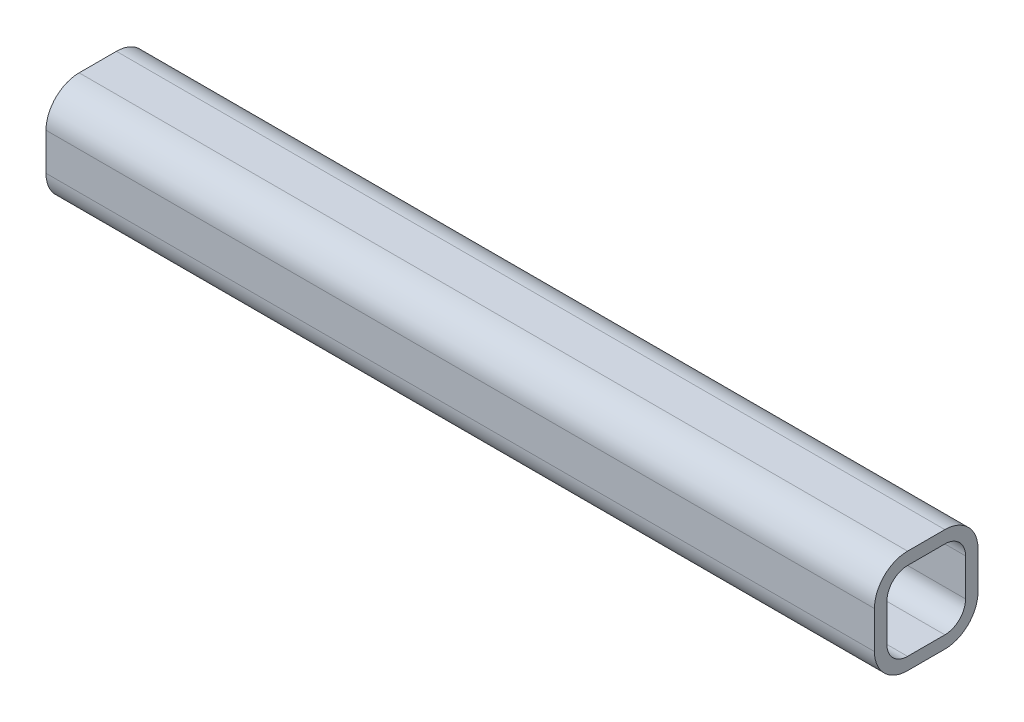
ISO-10303-21;
HEADER;
FILE_DESCRIPTION(('STEP AP214'),'2;1');
FILE_NAME('part.step','',(''),(''),'','','');
FILE_SCHEMA(('AUTOMOTIVE_DESIGN { 1 0 10303 214 1 1 1 1 }'));
ENDSEC;
DATA;
#1=APPLICATION_CONTEXT('core data for automotive mechanical design processes');
#2=APPLICATION_PROTOCOL_DEFINITION('international standard','automotive_design',2000,#1);
#3=PRODUCT_CONTEXT('',#1,'mechanical');
#4=PRODUCT('Part','Part','',(#3));
#5=PRODUCT_RELATED_PRODUCT_CATEGORY('part','',(#4));
#6=PRODUCT_DEFINITION_FORMATION('','',#4);
#7=PRODUCT_DEFINITION_CONTEXT('part definition',#1,'design');
#8=PRODUCT_DEFINITION('design','',#6,#7);
#9=PRODUCT_DEFINITION_SHAPE('','',#8);
#10=(LENGTH_UNIT() NAMED_UNIT(*) SI_UNIT(.MILLI.,.METRE.));
#11=(NAMED_UNIT(*) PLANE_ANGLE_UNIT() SI_UNIT($,.RADIAN.));
#12=(NAMED_UNIT(*) SI_UNIT($,.STERADIAN.) SOLID_ANGLE_UNIT());
#13=UNCERTAINTY_MEASURE_WITH_UNIT(LENGTH_MEASURE(1.E-05),#10,'distance_accuracy_value','');
#14=(GEOMETRIC_REPRESENTATION_CONTEXT(3) GLOBAL_UNCERTAINTY_ASSIGNED_CONTEXT((#13)) GLOBAL_UNIT_ASSIGNED_CONTEXT((#10,
#11,#12)) REPRESENTATION_CONTEXT('',''));
#15=CARTESIAN_POINT('',(0.,0.,0.));
#16=DIRECTION('',(0.,0.,1.));
#17=DIRECTION('',(1.,0.,0.));
#18=AXIS2_PLACEMENT_3D('',#15,#16,#17);
#19=CARTESIAN_POINT('',(0.,4.5,4.5));
#20=DIRECTION('',(1.,0.,0.));
#21=DIRECTION('',(0.,0.,-1.));
#22=AXIS2_PLACEMENT_3D('',#19,#20,#21);
#23=PLANE('',#22);
#24=DIRECTION('',(0.,0.,1.));
#25=VECTOR('',#24,1.);
#26=CARTESIAN_POINT('',(0.,9.5,4.5));
#27=LINE('',#26,#25);
#28=CARTESIAN_POINT('',(0.,9.5,-4.5));
#29=VERTEX_POINT('',#28);
#30=CARTESIAN_POINT('',(0.,9.5,4.5));
#31=VERTEX_POINT('',#30);
#32=EDGE_CURVE('E145',#29,#31,#27,.T.);
#33=ORIENTED_EDGE('',*,*,#32,.T.);
#34=CARTESIAN_POINT('',(0.,4.5,4.5));
#35=DIRECTION('',(1.,0.,0.));
#36=DIRECTION('',(0.,0.,-1.));
#37=AXIS2_PLACEMENT_3D('',#34,#35,#36);
#38=CIRCLE('',#37,5.);
#39=CARTESIAN_POINT('',(0.,4.5,9.5));
#40=VERTEX_POINT('',#39);
#41=EDGE_CURVE('E152',#31,#40,#38,.T.);
#42=ORIENTED_EDGE('',*,*,#41,.T.);
#43=DIRECTION('',(0.,-1.,0.));
#44=VECTOR('',#43,1.);
#45=CARTESIAN_POINT('',(0.,-4.5,9.5));
#46=LINE('',#45,#44);
#47=CARTESIAN_POINT('',(0.,-4.5,9.5));
#48=VERTEX_POINT('',#47);
#49=EDGE_CURVE('E428',#40,#48,#46,.T.);
#50=ORIENTED_EDGE('',*,*,#49,.T.);
#51=CARTESIAN_POINT('',(0.,-4.5,4.5));
#52=DIRECTION('',(1.,0.,0.));
#53=DIRECTION('',(0.,0.,-1.));
#54=AXIS2_PLACEMENT_3D('',#51,#52,#53);
#55=CIRCLE('',#54,5.);
#56=CARTESIAN_POINT('',(0.,-9.5,4.5));
#57=VERTEX_POINT('',#56);
#58=EDGE_CURVE('E421',#48,#57,#55,.T.);
#59=ORIENTED_EDGE('',*,*,#58,.T.);
#60=DIRECTION('',(0.,0.,-1.));
#61=VECTOR('',#60,1.);
#62=CARTESIAN_POINT('',(0.,-9.5,4.5));
#63=LINE('',#62,#61);
#64=CARTESIAN_POINT('',(0.,-9.5,-4.5));
#65=VERTEX_POINT('',#64);
#66=EDGE_CURVE('E413',#57,#65,#63,.T.);
#67=ORIENTED_EDGE('',*,*,#66,.T.);
#68=CARTESIAN_POINT('',(0.,-4.5,-4.5));
#69=DIRECTION('',(1.,0.,0.));
#70=DIRECTION('',(0.,0.,-1.));
#71=AXIS2_PLACEMENT_3D('',#68,#69,#70);
#72=CIRCLE('',#71,5.);
#73=CARTESIAN_POINT('',(0.,-4.5,-9.5));
#74=VERTEX_POINT('',#73);
#75=EDGE_CURVE('E169',#65,#74,#72,.T.);
#76=ORIENTED_EDGE('',*,*,#75,.T.);
#77=DIRECTION('',(0.,1.,0.));
#78=VECTOR('',#77,1.);
#79=CARTESIAN_POINT('',(0.,-4.5,-9.5));
#80=LINE('',#79,#78);
#81=CARTESIAN_POINT('',(0.,4.5,-9.5));
#82=VERTEX_POINT('',#81);
#83=EDGE_CURVE('E167',#74,#82,#80,.T.);
#84=ORIENTED_EDGE('',*,*,#83,.T.);
#85=CARTESIAN_POINT('',(0.,4.5,-4.5));
#86=DIRECTION('',(1.,0.,0.));
#87=DIRECTION('',(0.,0.,-1.));
#88=AXIS2_PLACEMENT_3D('',#85,#86,#87);
#89=CIRCLE('',#88,5.);
#90=EDGE_CURVE('E157',#82,#29,#89,.T.);
#91=ORIENTED_EDGE('',*,*,#90,.T.);
#92=EDGE_LOOP('',(#33,#42,#50,#59,#67,#76,#84,#91));
#93=FACE_BOUND('',#92,.T.);
#94=CARTESIAN_POINT('',(0.,4.5,4.5));
#95=DIRECTION('',(1.,0.,0.));
#96=DIRECTION('',(0.,0.,-1.));
#97=AXIS2_PLACEMENT_3D('',#94,#95,#96);
#98=CIRCLE('',#97,8.);
#99=CARTESIAN_POINT('',(0.,12.5,4.5));
#100=VERTEX_POINT('',#99);
#101=CARTESIAN_POINT('',(0.,4.5,12.5));
#102=VERTEX_POINT('',#101);
#103=EDGE_CURVE('E36',#100,#102,#98,.T.);
#104=ORIENTED_EDGE('',*,*,#103,.F.);
#105=DIRECTION('',(0.,0.,1.));
#106=VECTOR('',#105,1.);
#107=CARTESIAN_POINT('',(0.,12.5,4.5));
#108=LINE('',#107,#106);
#109=CARTESIAN_POINT('',(0.,12.5,-4.5));
#110=VERTEX_POINT('',#109);
#111=EDGE_CURVE('E176',#110,#100,#108,.T.);
#112=ORIENTED_EDGE('',*,*,#111,.F.);
#113=CARTESIAN_POINT('',(0.,4.5,-4.5));
#114=DIRECTION('',(1.,0.,0.));
#115=DIRECTION('',(0.,0.,-1.));
#116=AXIS2_PLACEMENT_3D('',#113,#114,#115);
#117=CIRCLE('',#116,8.);
#118=CARTESIAN_POINT('',(0.,4.5,-12.5));
#119=VERTEX_POINT('',#118);
#120=EDGE_CURVE('E185',#119,#110,#117,.T.);
#121=ORIENTED_EDGE('',*,*,#120,.F.);
#122=DIRECTION('',(0.,1.,0.));
#123=VECTOR('',#122,1.);
#124=CARTESIAN_POINT('',(0.,4.5,-12.5));
#125=LINE('',#124,#123);
#126=CARTESIAN_POINT('',(0.,-4.5,-12.5));
#127=VERTEX_POINT('',#126);
#128=EDGE_CURVE('E219',#127,#119,#125,.T.);
#129=ORIENTED_EDGE('',*,*,#128,.F.);
#130=CARTESIAN_POINT('',(0.,-4.5,-4.5));
#131=DIRECTION('',(1.,0.,0.));
#132=DIRECTION('',(0.,0.,-1.));
#133=AXIS2_PLACEMENT_3D('',#130,#131,#132);
#134=CIRCLE('',#133,8.);
#135=CARTESIAN_POINT('',(0.,-12.5,-4.5));
#136=VERTEX_POINT('',#135);
#137=EDGE_CURVE('E222',#136,#127,#134,.T.);
#138=ORIENTED_EDGE('',*,*,#137,.F.);
#139=DIRECTION('',(0.,0.,-1.));
#140=VECTOR('',#139,1.);
#141=CARTESIAN_POINT('',(0.,-12.5,4.5));
#142=LINE('',#141,#140);
#143=CARTESIAN_POINT('',(0.,-12.5,4.5));
#144=VERTEX_POINT('',#143);
#145=EDGE_CURVE('E225',#144,#136,#142,.T.);
#146=ORIENTED_EDGE('',*,*,#145,.F.);
#147=CARTESIAN_POINT('',(0.,-4.5,4.5));
#148=DIRECTION('',(1.,0.,0.));
#149=DIRECTION('',(0.,0.,-1.));
#150=AXIS2_PLACEMENT_3D('',#147,#148,#149);
#151=CIRCLE('',#150,8.);
#152=CARTESIAN_POINT('',(0.,-4.5,12.5));
#153=VERTEX_POINT('',#152);
#154=EDGE_CURVE('E228',#153,#144,#151,.T.);
#155=ORIENTED_EDGE('',*,*,#154,.F.);
#156=DIRECTION('',(0.,-1.,0.));
#157=VECTOR('',#156,1.);
#158=CARTESIAN_POINT('',(0.,4.5,12.5));
#159=LINE('',#158,#157);
#160=EDGE_CURVE('E230',#102,#153,#159,.T.);
#161=ORIENTED_EDGE('',*,*,#160,.F.);
#162=EDGE_LOOP('',(#104,#112,#121,#129,#138,#146,#155,#161));
#163=FACE_BOUND('',#162,.T.);
#164=ADVANCED_FACE('F32',(#93,#163),#23,.F.);
#165=CARTESIAN_POINT('',(200.,4.5,4.5));
#166=DIRECTION('',(1.,0.,0.));
#167=DIRECTION('',(0.,0.,-1.));
#168=AXIS2_PLACEMENT_3D('',#165,#166,#167);
#169=PLANE('',#168);
#170=CARTESIAN_POINT('',(200.,4.5,4.5));
#171=DIRECTION('',(1.,0.,0.));
#172=DIRECTION('',(0.,0.,-1.));
#173=AXIS2_PLACEMENT_3D('',#170,#171,#172);
#174=CIRCLE('',#173,5.);
#175=CARTESIAN_POINT('',(200.,9.5,4.5));
#176=VERTEX_POINT('',#175);
#177=CARTESIAN_POINT('',(200.,4.5,9.5));
#178=VERTEX_POINT('',#177);
#179=EDGE_CURVE('E437',#176,#178,#174,.T.);
#180=ORIENTED_EDGE('',*,*,#179,.F.);
#181=DIRECTION('',(0.,0.,1.));
#182=VECTOR('',#181,1.);
#183=CARTESIAN_POINT('',(200.,9.5,4.5));
#184=LINE('',#183,#182);
#185=CARTESIAN_POINT('',(200.,9.5,-4.5));
#186=VERTEX_POINT('',#185);
#187=EDGE_CURVE('E162',#186,#176,#184,.T.);
#188=ORIENTED_EDGE('',*,*,#187,.F.);
#189=CARTESIAN_POINT('',(200.,4.5,-4.5));
#190=DIRECTION('',(1.,0.,0.));
#191=DIRECTION('',(0.,0.,-1.));
#192=AXIS2_PLACEMENT_3D('',#189,#190,#191);
#193=CIRCLE('',#192,5.);
#194=CARTESIAN_POINT('',(200.,4.5,-9.5));
#195=VERTEX_POINT('',#194);
#196=EDGE_CURVE('E160',#195,#186,#193,.T.);
#197=ORIENTED_EDGE('',*,*,#196,.F.);
#198=DIRECTION('',(0.,1.,0.));
#199=VECTOR('',#198,1.);
#200=CARTESIAN_POINT('',(200.,-4.5,-9.5));
#201=LINE('',#200,#199);
#202=CARTESIAN_POINT('',(200.,-4.5,-9.5));
#203=VERTEX_POINT('',#202);
#204=EDGE_CURVE('E405',#203,#195,#201,.T.);
#205=ORIENTED_EDGE('',*,*,#204,.F.);
#206=CARTESIAN_POINT('',(200.,-4.5,-4.5));
#207=DIRECTION('',(1.,0.,0.));
#208=DIRECTION('',(0.,0.,-1.));
#209=AXIS2_PLACEMENT_3D('',#206,#207,#208);
#210=CIRCLE('',#209,5.);
#211=CARTESIAN_POINT('',(200.,-9.5,-4.5));
#212=VERTEX_POINT('',#211);
#213=EDGE_CURVE('E407',#212,#203,#210,.T.);
#214=ORIENTED_EDGE('',*,*,#213,.F.);
#215=DIRECTION('',(0.,0.,-1.));
#216=VECTOR('',#215,1.);
#217=CARTESIAN_POINT('',(200.,-9.5,4.5));
#218=LINE('',#217,#216);
#219=CARTESIAN_POINT('',(200.,-9.5,4.5));
#220=VERTEX_POINT('',#219);
#221=EDGE_CURVE('E416',#220,#212,#218,.T.);
#222=ORIENTED_EDGE('',*,*,#221,.F.);
#223=CARTESIAN_POINT('',(200.,-4.5,4.5));
#224=DIRECTION('',(1.,0.,0.));
#225=DIRECTION('',(0.,0.,-1.));
#226=AXIS2_PLACEMENT_3D('',#223,#224,#225);
#227=CIRCLE('',#226,5.);
#228=CARTESIAN_POINT('',(200.,-4.5,9.5));
#229=VERTEX_POINT('',#228);
#230=EDGE_CURVE('E424',#229,#220,#227,.T.);
#231=ORIENTED_EDGE('',*,*,#230,.F.);
#232=DIRECTION('',(0.,-1.,0.));
#233=VECTOR('',#232,1.);
#234=CARTESIAN_POINT('',(200.,-4.5,9.5));
#235=LINE('',#234,#233);
#236=EDGE_CURVE('E430',#178,#229,#235,.T.);
#237=ORIENTED_EDGE('',*,*,#236,.F.);
#238=EDGE_LOOP('',(#180,#188,#197,#205,#214,#222,#231,#237));
#239=FACE_BOUND('',#238,.T.);
#240=CARTESIAN_POINT('',(200.,4.5,4.5));
#241=DIRECTION('',(1.,0.,0.));
#242=DIRECTION('',(0.,0.,-1.));
#243=AXIS2_PLACEMENT_3D('',#240,#241,#242);
#244=CIRCLE('',#243,8.);
#245=CARTESIAN_POINT('',(200.,12.5,4.5));
#246=VERTEX_POINT('',#245);
#247=CARTESIAN_POINT('',(200.,4.5,12.5));
#248=VERTEX_POINT('',#247);
#249=EDGE_CURVE('E180',#246,#248,#244,.T.);
#250=ORIENTED_EDGE('',*,*,#249,.T.);
#251=DIRECTION('',(0.,-1.,0.));
#252=VECTOR('',#251,1.);
#253=CARTESIAN_POINT('',(200.,4.5,12.5));
#254=LINE('',#253,#252);
#255=CARTESIAN_POINT('',(200.,-4.5,12.5));
#256=VERTEX_POINT('',#255);
#257=EDGE_CURVE('E189',#248,#256,#254,.T.);
#258=ORIENTED_EDGE('',*,*,#257,.T.);
#259=CARTESIAN_POINT('',(200.,-4.5,4.5));
#260=DIRECTION('',(1.,0.,0.));
#261=DIRECTION('',(0.,0.,-1.));
#262=AXIS2_PLACEMENT_3D('',#259,#260,#261);
#263=CIRCLE('',#262,8.);
#264=CARTESIAN_POINT('',(200.,-12.5,4.5));
#265=VERTEX_POINT('',#264);
#266=EDGE_CURVE('E193',#256,#265,#263,.T.);
#267=ORIENTED_EDGE('',*,*,#266,.T.);
#268=DIRECTION('',(0.,0.,-1.));
#269=VECTOR('',#268,1.);
#270=CARTESIAN_POINT('',(200.,-12.5,4.5));
#271=LINE('',#270,#269);
#272=CARTESIAN_POINT('',(200.,-12.5,-4.5));
#273=VERTEX_POINT('',#272);
#274=EDGE_CURVE('E197',#265,#273,#271,.T.);
#275=ORIENTED_EDGE('',*,*,#274,.T.);
#276=CARTESIAN_POINT('',(200.,-4.5,-4.5));
#277=DIRECTION('',(1.,0.,0.));
#278=DIRECTION('',(0.,0.,-1.));
#279=AXIS2_PLACEMENT_3D('',#276,#277,#278);
#280=CIRCLE('',#279,8.);
#281=CARTESIAN_POINT('',(200.,-4.5,-12.5));
#282=VERTEX_POINT('',#281);
#283=EDGE_CURVE('E201',#273,#282,#280,.T.);
#284=ORIENTED_EDGE('',*,*,#283,.T.);
#285=DIRECTION('',(0.,1.,0.));
#286=VECTOR('',#285,1.);
#287=CARTESIAN_POINT('',(200.,4.5,-12.5));
#288=LINE('',#287,#286);
#289=CARTESIAN_POINT('',(200.,4.5,-12.5));
#290=VERTEX_POINT('',#289);
#291=EDGE_CURVE('E205',#282,#290,#288,.T.);
#292=ORIENTED_EDGE('',*,*,#291,.T.);
#293=CARTESIAN_POINT('',(200.,4.5,-4.5));
#294=DIRECTION('',(1.,0.,0.));
#295=DIRECTION('',(0.,0.,-1.));
#296=AXIS2_PLACEMENT_3D('',#293,#294,#295);
#297=CIRCLE('',#296,8.);
#298=CARTESIAN_POINT('',(200.,12.5,-4.5));
#299=VERTEX_POINT('',#298);
#300=EDGE_CURVE('E11',#290,#299,#297,.T.);
#301=ORIENTED_EDGE('',*,*,#300,.T.);
#302=DIRECTION('',(0.,0.,1.));
#303=VECTOR('',#302,1.);
#304=CARTESIAN_POINT('',(200.,12.5,4.5));
#305=LINE('',#304,#303);
#306=EDGE_CURVE('E181',#299,#246,#305,.T.);
#307=ORIENTED_EDGE('',*,*,#306,.T.);
#308=EDGE_LOOP('',(#250,#258,#267,#275,#284,#292,#301,#307));
#309=FACE_BOUND('',#308,.T.);
#310=ADVANCED_FACE('F244',(#239,#309),#169,.T.);
#311=CARTESIAN_POINT('',(0.,12.5,4.5));
#312=DIRECTION('',(0.,1.,0.));
#313=DIRECTION('',(0.,0.,1.));
#314=AXIS2_PLACEMENT_3D('',#311,#312,#313);
#315=PLANE('',#314);
#316=DIRECTION('',(1.,0.,0.));
#317=VECTOR('',#316,1.);
#318=CARTESIAN_POINT('',(0.,12.5,4.5));
#319=LINE('',#318,#317);
#320=EDGE_CURVE('E177',#100,#246,#319,.T.);
#321=ORIENTED_EDGE('',*,*,#320,.T.);
#322=ORIENTED_EDGE('',*,*,#306,.F.);
#323=DIRECTION('',(1.,0.,0.));
#324=VECTOR('',#323,1.);
#325=CARTESIAN_POINT('',(0.,12.5,-4.5));
#326=LINE('',#325,#324);
#327=EDGE_CURVE('E182',#110,#299,#326,.T.);
#328=ORIENTED_EDGE('',*,*,#327,.F.);
#329=ORIENTED_EDGE('',*,*,#111,.T.);
#330=EDGE_LOOP('',(#321,#322,#328,#329));
#331=FACE_BOUND('',#330,.T.);
#332=ADVANCED_FACE('F265',(#331),#315,.T.);
#333=CARTESIAN_POINT('',(0.,4.5,4.5));
#334=DIRECTION('',(1.,0.,0.));
#335=DIRECTION('',(0.,0.,-1.));
#336=AXIS2_PLACEMENT_3D('',#333,#334,#335);
#337=CYLINDRICAL_SURFACE('',#336,8.);
#338=DIRECTION('',(1.,0.,0.));
#339=VECTOR('',#338,1.);
#340=CARTESIAN_POINT('',(0.,4.5,12.5));
#341=LINE('',#340,#339);
#342=EDGE_CURVE('E186',#102,#248,#341,.T.);
#343=ORIENTED_EDGE('',*,*,#342,.T.);
#344=ORIENTED_EDGE('',*,*,#249,.F.);
#345=ORIENTED_EDGE('',*,*,#320,.F.);
#346=ORIENTED_EDGE('',*,*,#103,.T.);
#347=EDGE_LOOP('',(#343,#344,#345,#346));
#348=FACE_BOUND('',#347,.T.);
#349=ADVANCED_FACE('F238',(#348),#337,.T.);
#350=CARTESIAN_POINT('',(0.,-4.5,12.5));
#351=DIRECTION('',(0.,0.,1.));
#352=DIRECTION('',(1.,0.,0.));
#353=AXIS2_PLACEMENT_3D('',#350,#351,#352);
#354=PLANE('',#353);
#355=DIRECTION('',(1.,0.,0.));
#356=VECTOR('',#355,1.);
#357=CARTESIAN_POINT('',(0.,-4.5,12.5));
#358=LINE('',#357,#356);
#359=EDGE_CURVE('E190',#153,#256,#358,.T.);
#360=ORIENTED_EDGE('',*,*,#359,.T.);
#361=ORIENTED_EDGE('',*,*,#257,.F.);
#362=ORIENTED_EDGE('',*,*,#342,.F.);
#363=ORIENTED_EDGE('',*,*,#160,.T.);
#364=EDGE_LOOP('',(#360,#361,#362,#363));
#365=FACE_BOUND('',#364,.T.);
#366=ADVANCED_FACE('F241',(#365),#354,.T.);
#367=CARTESIAN_POINT('',(0.,-4.5,4.5));
#368=DIRECTION('',(1.,0.,0.));
#369=DIRECTION('',(0.,0.,-1.));
#370=AXIS2_PLACEMENT_3D('',#367,#368,#369);
#371=CYLINDRICAL_SURFACE('',#370,8.);
#372=DIRECTION('',(1.,0.,0.));
#373=VECTOR('',#372,1.);
#374=CARTESIAN_POINT('',(0.,-12.5,4.5));
#375=LINE('',#374,#373);
#376=EDGE_CURVE('E194',#144,#265,#375,.T.);
#377=ORIENTED_EDGE('',*,*,#376,.T.);
#378=ORIENTED_EDGE('',*,*,#266,.F.);
#379=ORIENTED_EDGE('',*,*,#359,.F.);
#380=ORIENTED_EDGE('',*,*,#154,.T.);
#381=EDGE_LOOP('',(#377,#378,#379,#380));
#382=FACE_BOUND('',#381,.T.);
#383=ADVANCED_FACE('F247',(#382),#371,.T.);
#384=CARTESIAN_POINT('',(0.,-12.5,4.5));
#385=DIRECTION('',(0.,-1.,0.));
#386=DIRECTION('',(0.,0.,-1.));
#387=AXIS2_PLACEMENT_3D('',#384,#385,#386);
#388=PLANE('',#387);
#389=DIRECTION('',(1.,0.,0.));
#390=VECTOR('',#389,1.);
#391=CARTESIAN_POINT('',(0.,-12.5,-4.5));
#392=LINE('',#391,#390);
#393=EDGE_CURVE('E198',#136,#273,#392,.T.);
#394=ORIENTED_EDGE('',*,*,#393,.T.);
#395=ORIENTED_EDGE('',*,*,#274,.F.);
#396=ORIENTED_EDGE('',*,*,#376,.F.);
#397=ORIENTED_EDGE('',*,*,#145,.T.);
#398=EDGE_LOOP('',(#394,#395,#396,#397));
#399=FACE_BOUND('',#398,.T.);
#400=ADVANCED_FACE('F250',(#399),#388,.T.);
#401=CARTESIAN_POINT('',(0.,-4.5,-4.5));
#402=DIRECTION('',(1.,0.,0.));
#403=DIRECTION('',(0.,0.,-1.));
#404=AXIS2_PLACEMENT_3D('',#401,#402,#403);
#405=CYLINDRICAL_SURFACE('',#404,8.);
#406=DIRECTION('',(1.,0.,0.));
#407=VECTOR('',#406,1.);
#408=CARTESIAN_POINT('',(0.,-4.5,-12.5));
#409=LINE('',#408,#407);
#410=EDGE_CURVE('E202',#127,#282,#409,.T.);
#411=ORIENTED_EDGE('',*,*,#410,.T.);
#412=ORIENTED_EDGE('',*,*,#283,.F.);
#413=ORIENTED_EDGE('',*,*,#393,.F.);
#414=ORIENTED_EDGE('',*,*,#137,.T.);
#415=EDGE_LOOP('',(#411,#412,#413,#414));
#416=FACE_BOUND('',#415,.T.);
#417=ADVANCED_FACE('F255',(#416),#405,.T.);
#418=CARTESIAN_POINT('',(0.,-4.5,-12.5));
#419=DIRECTION('',(0.,0.,-1.));
#420=DIRECTION('',(-1.,0.,0.));
#421=AXIS2_PLACEMENT_3D('',#418,#419,#420);
#422=PLANE('',#421);
#423=DIRECTION('',(-1.,0.,0.));
#424=VECTOR('',#423,1.);
#425=CARTESIAN_POINT('',(0.,4.5,-12.5));
#426=LINE('',#425,#424);
#427=EDGE_CURVE('E41',#119,#290,#426,.F.);
#428=ORIENTED_EDGE('',*,*,#427,.T.);
#429=ORIENTED_EDGE('',*,*,#291,.F.);
#430=ORIENTED_EDGE('',*,*,#410,.F.);
#431=ORIENTED_EDGE('',*,*,#128,.T.);
#432=EDGE_LOOP('',(#428,#429,#430,#431));
#433=FACE_BOUND('',#432,.T.);
#434=ADVANCED_FACE('F258',(#433),#422,.T.);
#435=CARTESIAN_POINT('',(0.,4.5,-4.5));
#436=DIRECTION('',(1.,0.,0.));
#437=DIRECTION('',(0.,0.,-1.));
#438=AXIS2_PLACEMENT_3D('',#435,#436,#437);
#439=CYLINDRICAL_SURFACE('',#438,8.);
#440=ORIENTED_EDGE('',*,*,#300,.F.);
#441=ORIENTED_EDGE('',*,*,#427,.F.);
#442=ORIENTED_EDGE('',*,*,#120,.T.);
#443=ORIENTED_EDGE('',*,*,#327,.T.);
#444=EDGE_LOOP('',(#440,#441,#442,#443));
#445=FACE_BOUND('',#444,.T.);
#446=ADVANCED_FACE('F34',(#445),#439,.T.);
#447=CARTESIAN_POINT('',(0.,9.5,4.5));
#448=DIRECTION('',(0.,1.,0.));
#449=DIRECTION('',(0.,0.,1.));
#450=AXIS2_PLACEMENT_3D('',#447,#448,#449);
#451=PLANE('',#450);
#452=DIRECTION('',(1.,0.,0.));
#453=VECTOR('',#452,1.);
#454=CARTESIAN_POINT('',(0.,9.5,4.5));
#455=LINE('',#454,#453);
#456=EDGE_CURVE('E148',#31,#176,#455,.T.);
#457=ORIENTED_EDGE('',*,*,#456,.F.);
#458=ORIENTED_EDGE('',*,*,#32,.F.);
#459=DIRECTION('',(1.,0.,0.));
#460=VECTOR('',#459,1.);
#461=CARTESIAN_POINT('',(0.,9.5,-4.5));
#462=LINE('',#461,#460);
#463=EDGE_CURVE('E57',#29,#186,#462,.T.);
#464=ORIENTED_EDGE('',*,*,#463,.T.);
#465=ORIENTED_EDGE('',*,*,#187,.T.);
#466=EDGE_LOOP('',(#457,#458,#464,#465));
#467=FACE_BOUND('',#466,.T.);
#468=ADVANCED_FACE('F146',(#467),#451,.F.);
#469=CARTESIAN_POINT('',(0.,4.5,4.5));
#470=DIRECTION('',(1.,0.,0.));
#471=DIRECTION('',(0.,0.,-1.));
#472=AXIS2_PLACEMENT_3D('',#469,#470,#471);
#473=CYLINDRICAL_SURFACE('',#472,5.);
#474=DIRECTION('',(1.,0.,0.));
#475=VECTOR('',#474,1.);
#476=CARTESIAN_POINT('',(0.,4.5,9.5));
#477=LINE('',#476,#475);
#478=EDGE_CURVE('E432',#40,#178,#477,.T.);
#479=ORIENTED_EDGE('',*,*,#478,.F.);
#480=ORIENTED_EDGE('',*,*,#41,.F.);
#481=ORIENTED_EDGE('',*,*,#456,.T.);
#482=ORIENTED_EDGE('',*,*,#179,.T.);
#483=EDGE_LOOP('',(#479,#480,#481,#482));
#484=FACE_BOUND('',#483,.T.);
#485=ADVANCED_FACE('F282',(#484),#473,.F.);
#486=CARTESIAN_POINT('',(0.,-4.5,9.5));
#487=DIRECTION('',(0.,0.,1.));
#488=DIRECTION('',(1.,0.,0.));
#489=AXIS2_PLACEMENT_3D('',#486,#487,#488);
#490=PLANE('',#489);
#491=DIRECTION('',(1.,0.,0.));
#492=VECTOR('',#491,1.);
#493=CARTESIAN_POINT('',(0.,-4.5,9.5));
#494=LINE('',#493,#492);
#495=EDGE_CURVE('E49',#48,#229,#494,.T.);
#496=ORIENTED_EDGE('',*,*,#495,.F.);
#497=ORIENTED_EDGE('',*,*,#49,.F.);
#498=ORIENTED_EDGE('',*,*,#478,.T.);
#499=ORIENTED_EDGE('',*,*,#236,.T.);
#500=EDGE_LOOP('',(#496,#497,#498,#499));
#501=FACE_BOUND('',#500,.T.);
#502=ADVANCED_FACE('F344',(#501),#490,.F.);
#503=CARTESIAN_POINT('',(0.,-4.5,4.5));
#504=DIRECTION('',(1.,0.,0.));
#505=DIRECTION('',(0.,0.,-1.));
#506=AXIS2_PLACEMENT_3D('',#503,#504,#505);
#507=CYLINDRICAL_SURFACE('',#506,5.);
#508=DIRECTION('',(1.,0.,0.));
#509=VECTOR('',#508,1.);
#510=CARTESIAN_POINT('',(0.,-9.5,4.5));
#511=LINE('',#510,#509);
#512=EDGE_CURVE('E418',#57,#220,#511,.T.);
#513=ORIENTED_EDGE('',*,*,#512,.F.);
#514=ORIENTED_EDGE('',*,*,#58,.F.);
#515=ORIENTED_EDGE('',*,*,#495,.T.);
#516=ORIENTED_EDGE('',*,*,#230,.T.);
#517=EDGE_LOOP('',(#513,#514,#515,#516));
#518=FACE_BOUND('',#517,.T.);
#519=ADVANCED_FACE('F354',(#518),#507,.F.);
#520=CARTESIAN_POINT('',(0.,-9.5,4.5));
#521=DIRECTION('',(0.,-1.,0.));
#522=DIRECTION('',(0.,0.,-1.));
#523=AXIS2_PLACEMENT_3D('',#520,#521,#522);
#524=PLANE('',#523);
#525=DIRECTION('',(1.,0.,0.));
#526=VECTOR('',#525,1.);
#527=CARTESIAN_POINT('',(0.,-9.5,-4.5));
#528=LINE('',#527,#526);
#529=EDGE_CURVE('E411',#65,#212,#528,.T.);
#530=ORIENTED_EDGE('',*,*,#529,.F.);
#531=ORIENTED_EDGE('',*,*,#66,.F.);
#532=ORIENTED_EDGE('',*,*,#512,.T.);
#533=ORIENTED_EDGE('',*,*,#221,.T.);
#534=EDGE_LOOP('',(#530,#531,#532,#533));
#535=FACE_BOUND('',#534,.T.);
#536=ADVANCED_FACE('F363',(#535),#524,.F.);
#537=CARTESIAN_POINT('',(0.,-4.5,-4.5));
#538=DIRECTION('',(1.,0.,0.));
#539=DIRECTION('',(0.,0.,-1.));
#540=AXIS2_PLACEMENT_3D('',#537,#538,#539);
#541=CYLINDRICAL_SURFACE('',#540,5.);
#542=DIRECTION('',(1.,0.,0.));
#543=VECTOR('',#542,1.);
#544=CARTESIAN_POINT('',(0.,-4.5,-9.5));
#545=LINE('',#544,#543);
#546=EDGE_CURVE('E406',#74,#203,#545,.T.);
#547=ORIENTED_EDGE('',*,*,#546,.F.);
#548=ORIENTED_EDGE('',*,*,#75,.F.);
#549=ORIENTED_EDGE('',*,*,#529,.T.);
#550=ORIENTED_EDGE('',*,*,#213,.T.);
#551=EDGE_LOOP('',(#547,#548,#549,#550));
#552=FACE_BOUND('',#551,.T.);
#553=ADVANCED_FACE('F373',(#552),#541,.F.);
#554=CARTESIAN_POINT('',(0.,-4.5,-9.5));
#555=DIRECTION('',(0.,0.,-1.));
#556=DIRECTION('',(-1.,0.,0.));
#557=AXIS2_PLACEMENT_3D('',#554,#555,#556);
#558=PLANE('',#557);
#559=DIRECTION('',(1.,0.,0.));
#560=VECTOR('',#559,1.);
#561=CARTESIAN_POINT('',(0.,4.5,-9.5));
#562=LINE('',#561,#560);
#563=EDGE_CURVE('E173',#82,#195,#562,.T.);
#564=ORIENTED_EDGE('',*,*,#563,.F.);
#565=ORIENTED_EDGE('',*,*,#83,.F.);
#566=ORIENTED_EDGE('',*,*,#546,.T.);
#567=ORIENTED_EDGE('',*,*,#204,.T.);
#568=EDGE_LOOP('',(#564,#565,#566,#567));
#569=FACE_BOUND('',#568,.T.);
#570=ADVANCED_FACE('F275',(#569),#558,.F.);
#571=CARTESIAN_POINT('',(0.,4.5,-4.5));
#572=DIRECTION('',(1.,0.,0.));
#573=DIRECTION('',(0.,0.,-1.));
#574=AXIS2_PLACEMENT_3D('',#571,#572,#573);
#575=CYLINDRICAL_SURFACE('',#574,5.);
#576=ORIENTED_EDGE('',*,*,#196,.T.);
#577=ORIENTED_EDGE('',*,*,#463,.F.);
#578=ORIENTED_EDGE('',*,*,#90,.F.);
#579=ORIENTED_EDGE('',*,*,#563,.T.);
#580=EDGE_LOOP('',(#576,#577,#578,#579));
#581=FACE_BOUND('',#580,.T.);
#582=ADVANCED_FACE('F155',(#581),#575,.F.);
#583=CLOSED_SHELL('',(#164,#310,#332,#349,#366,#383,#400,#417,#434,#446,#468,#485,#502,#519,
#536,#553,#570,#582));
#584=MANIFOLD_SOLID_BREP('B2',#583);
#585=ADVANCED_BREP_SHAPE_REPRESENTATION('',(#18,#584),#14);
#586=SHAPE_DEFINITION_REPRESENTATION(#9,#585);
ENDSEC;
END-ISO-10303-21;
